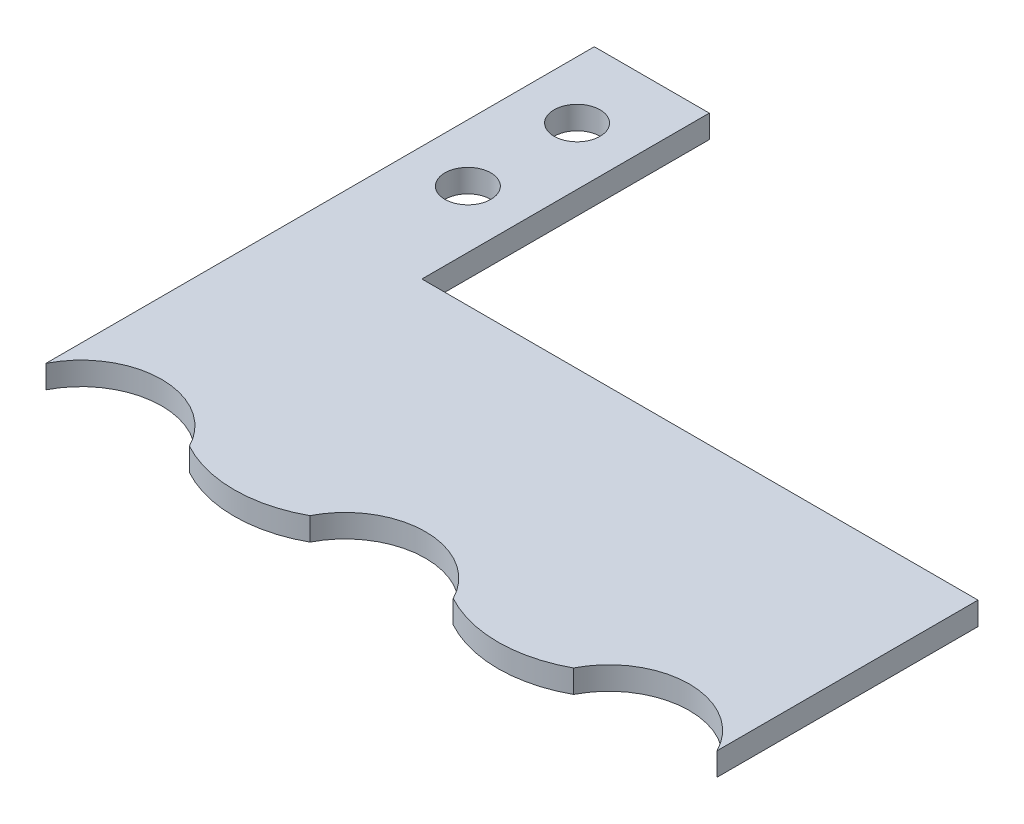
ISO-10303-21;
HEADER;
FILE_DESCRIPTION(('STEP AP214'),'2;1');
FILE_NAME('part.step','',(''),(''),'','','');
FILE_SCHEMA(('AUTOMOTIVE_DESIGN { 1 0 10303 214 1 1 1 1 }'));
ENDSEC;
DATA;
#1=APPLICATION_CONTEXT('core data for automotive mechanical design processes');
#2=APPLICATION_PROTOCOL_DEFINITION('international standard','automotive_design',2000,#1);
#3=PRODUCT_CONTEXT('',#1,'mechanical');
#4=PRODUCT('Part','Part','',(#3));
#5=PRODUCT_RELATED_PRODUCT_CATEGORY('part','',(#4));
#6=PRODUCT_DEFINITION_FORMATION('','',#4);
#7=PRODUCT_DEFINITION_CONTEXT('part definition',#1,'design');
#8=PRODUCT_DEFINITION('design','',#6,#7);
#9=PRODUCT_DEFINITION_SHAPE('','',#8);
#10=(LENGTH_UNIT() NAMED_UNIT(*) SI_UNIT(.MILLI.,.METRE.));
#11=(NAMED_UNIT(*) PLANE_ANGLE_UNIT() SI_UNIT($,.RADIAN.));
#12=(NAMED_UNIT(*) SI_UNIT($,.STERADIAN.) SOLID_ANGLE_UNIT());
#13=UNCERTAINTY_MEASURE_WITH_UNIT(LENGTH_MEASURE(1.E-05),#10,'distance_accuracy_value','');
#14=(GEOMETRIC_REPRESENTATION_CONTEXT(3) GLOBAL_UNCERTAINTY_ASSIGNED_CONTEXT((#13)) GLOBAL_UNIT_ASSIGNED_CONTEXT((#10,
#11,#12)) REPRESENTATION_CONTEXT('',''));
#15=CARTESIAN_POINT('',(0.,0.,0.));
#16=DIRECTION('',(0.,0.,1.));
#17=DIRECTION('',(1.,0.,0.));
#18=AXIS2_PLACEMENT_3D('',#15,#16,#17);
#19=CARTESIAN_POINT('',(-22.95,-2.,0.));
#20=DIRECTION('',(0.,1.,0.));
#21=DIRECTION('',(0.,0.,1.));
#22=AXIS2_PLACEMENT_3D('',#19,#20,#21);
#23=CYLINDRICAL_SURFACE('',#22,7.);
#24=CARTESIAN_POINT('',(-22.95,0.,0.));
#25=DIRECTION('',(0.,-1.,0.));
#26=DIRECTION('',(0.,0.,-1.));
#27=AXIS2_PLACEMENT_3D('',#24,#25,#26);
#28=CIRCLE('',#27,7.);
#29=CARTESIAN_POINT('',(-29.1876437453176,0.,-3.17675943478572));
#30=VERTEX_POINT('',#29);
#31=CARTESIAN_POINT('',(-16.7123562546824,0.,-3.17675943478572));
#32=VERTEX_POINT('',#31);
#33=EDGE_CURVE('E152',#30,#32,#28,.T.);
#34=ORIENTED_EDGE('',*,*,#33,.F.);
#35=DIRECTION('',(0.,1.,0.));
#36=VECTOR('',#35,1.);
#37=CARTESIAN_POINT('',(-29.1876437453176,-2.,-3.17675943478572));
#38=LINE('',#37,#36);
#39=CARTESIAN_POINT('',(-29.1876437453176,-2.,-3.17675943478572));
#40=VERTEX_POINT('',#39);
#41=EDGE_CURVE('E11',#40,#30,#38,.T.);
#42=ORIENTED_EDGE('',*,*,#41,.F.);
#43=CARTESIAN_POINT('',(-22.95,-2.,0.));
#44=DIRECTION('',(0.,-1.,0.));
#45=DIRECTION('',(0.,0.,-1.));
#46=AXIS2_PLACEMENT_3D('',#43,#44,#45);
#47=CIRCLE('',#46,7.);
#48=CARTESIAN_POINT('',(-16.7123562546824,-2.,-3.17675943478572));
#49=VERTEX_POINT('',#48);
#50=EDGE_CURVE('E177',#40,#49,#47,.T.);
#51=ORIENTED_EDGE('',*,*,#50,.T.);
#52=DIRECTION('',(0.,1.,0.));
#53=VECTOR('',#52,1.);
#54=CARTESIAN_POINT('',(-16.7123562546824,-2.,-3.17675943478572));
#55=LINE('',#54,#53);
#56=EDGE_CURVE('E46',#49,#32,#55,.T.);
#57=ORIENTED_EDGE('',*,*,#56,.T.);
#58=EDGE_LOOP('',(#34,#42,#51,#57));
#59=FACE_BOUND('',#58,.T.);
#60=ADVANCED_FACE('F43',(#59),#23,.F.);
#61=CARTESIAN_POINT('',(-29.1876437453176,-2.,-3.17675943478572));
#62=DIRECTION('',(-1.,0.,0.));
#63=DIRECTION('',(0.,0.,1.));
#64=AXIS2_PLACEMENT_3D('',#61,#62,#63);
#65=PLANE('',#64);
#66=DIRECTION('',(0.,0.,1.));
#67=VECTOR('',#66,1.);
#68=CARTESIAN_POINT('',(-29.1876437453176,0.,-3.17675943478572));
#69=LINE('',#68,#67);
#70=CARTESIAN_POINT('',(-29.1876437453176,0.,-50.875));
#71=VERTEX_POINT('',#70);
#72=EDGE_CURVE('E92',#71,#30,#69,.T.);
#73=ORIENTED_EDGE('',*,*,#72,.F.);
#74=DIRECTION('',(0.,1.,0.));
#75=VECTOR('',#74,1.);
#76=CARTESIAN_POINT('',(-29.1876437453176,-2.,-50.875));
#77=LINE('',#76,#75);
#78=CARTESIAN_POINT('',(-29.1876437453176,-2.,-50.875));
#79=VERTEX_POINT('',#78);
#80=EDGE_CURVE('E52',#79,#71,#77,.T.);
#81=ORIENTED_EDGE('',*,*,#80,.F.);
#82=DIRECTION('',(0.,0.,1.));
#83=VECTOR('',#82,1.);
#84=CARTESIAN_POINT('',(-29.1876437453176,-2.,-25.875));
#85=LINE('',#84,#83);
#86=EDGE_CURVE('E60',#79,#40,#85,.T.);
#87=ORIENTED_EDGE('',*,*,#86,.T.);
#88=ORIENTED_EDGE('',*,*,#41,.T.);
#89=EDGE_LOOP('',(#73,#81,#87,#88));
#90=FACE_BOUND('',#89,.T.);
#91=ADVANCED_FACE('F251',(#90),#65,.T.);
#92=CARTESIAN_POINT('',(-29.1876437453176,-2.,-50.875));
#93=DIRECTION('',(0.,0.,-1.));
#94=DIRECTION('',(-1.,0.,0.));
#95=AXIS2_PLACEMENT_3D('',#92,#93,#94);
#96=PLANE('',#95);
#97=DIRECTION('',(-1.,0.,0.));
#98=VECTOR('',#97,1.);
#99=CARTESIAN_POINT('',(-29.1876437453176,0.,-50.875));
#100=LINE('',#99,#98);
#101=CARTESIAN_POINT('',(-19.1876437453176,0.,-50.875));
#102=VERTEX_POINT('',#101);
#103=EDGE_CURVE('E129',#102,#71,#100,.T.);
#104=ORIENTED_EDGE('',*,*,#103,.F.);
#105=DIRECTION('',(0.,1.,0.));
#106=VECTOR('',#105,1.);
#107=CARTESIAN_POINT('',(-19.1876437453176,-2.,-50.875));
#108=LINE('',#107,#106);
#109=CARTESIAN_POINT('',(-19.1876437453176,-2.,-50.875));
#110=VERTEX_POINT('',#109);
#111=EDGE_CURVE('E124',#110,#102,#108,.T.);
#112=ORIENTED_EDGE('',*,*,#111,.F.);
#113=DIRECTION('',(-1.,0.,0.));
#114=VECTOR('',#113,1.);
#115=CARTESIAN_POINT('',(-29.1876437453176,-2.,-50.875));
#116=LINE('',#115,#114);
#117=EDGE_CURVE('E127',#110,#79,#116,.T.);
#118=ORIENTED_EDGE('',*,*,#117,.T.);
#119=ORIENTED_EDGE('',*,*,#80,.T.);
#120=EDGE_LOOP('',(#104,#112,#118,#119));
#121=FACE_BOUND('',#120,.T.);
#122=ADVANCED_FACE('F126',(#121),#96,.T.);
#123=CARTESIAN_POINT('',(-19.1876437453176,-2.,-50.875));
#124=DIRECTION('',(1.,0.,0.));
#125=DIRECTION('',(0.,0.,-1.));
#126=AXIS2_PLACEMENT_3D('',#123,#124,#125);
#127=PLANE('',#126);
#128=DIRECTION('',(0.,0.,-1.));
#129=VECTOR('',#128,1.);
#130=CARTESIAN_POINT('',(-19.1876437453176,0.,-50.875));
#131=LINE('',#130,#129);
#132=CARTESIAN_POINT('',(-19.1876437453176,0.,-25.875));
#133=VERTEX_POINT('',#132);
#134=EDGE_CURVE('E174',#133,#102,#131,.T.);
#135=ORIENTED_EDGE('',*,*,#134,.F.);
#136=DIRECTION('',(0.,1.,0.));
#137=VECTOR('',#136,1.);
#138=CARTESIAN_POINT('',(-19.1876437453176,-2.,-25.875));
#139=LINE('',#138,#137);
#140=CARTESIAN_POINT('',(-19.1876437453176,-2.,-25.875));
#141=VERTEX_POINT('',#140);
#142=EDGE_CURVE('E134',#141,#133,#139,.T.);
#143=ORIENTED_EDGE('',*,*,#142,.F.);
#144=DIRECTION('',(0.,0.,-1.));
#145=VECTOR('',#144,1.);
#146=CARTESIAN_POINT('',(-19.1876437453176,-2.,-50.875));
#147=LINE('',#146,#145);
#148=EDGE_CURVE('E141',#141,#110,#147,.T.);
#149=ORIENTED_EDGE('',*,*,#148,.T.);
#150=ORIENTED_EDGE('',*,*,#111,.T.);
#151=EDGE_LOOP('',(#135,#143,#149,#150));
#152=FACE_BOUND('',#151,.T.);
#153=ADVANCED_FACE('F144',(#152),#127,.T.);
#154=CARTESIAN_POINT('',(-19.1876437453176,-2.,-25.875));
#155=DIRECTION('',(0.,0.,-1.));
#156=DIRECTION('',(-1.,0.,0.));
#157=AXIS2_PLACEMENT_3D('',#154,#155,#156);
#158=PLANE('',#157);
#159=DIRECTION('',(-1.,0.,0.));
#160=VECTOR('',#159,1.);
#161=CARTESIAN_POINT('',(-19.1876437453176,0.,-25.875));
#162=LINE('',#161,#160);
#163=CARTESIAN_POINT('',(29.1876437453176,0.,-25.875));
#164=VERTEX_POINT('',#163);
#165=EDGE_CURVE('E171',#164,#133,#162,.T.);
#166=ORIENTED_EDGE('',*,*,#165,.F.);
#167=DIRECTION('',(0.,1.,0.));
#168=VECTOR('',#167,1.);
#169=CARTESIAN_POINT('',(29.1876437453176,-2.,-25.875));
#170=LINE('',#169,#168);
#171=CARTESIAN_POINT('',(29.1876437453176,-2.,-25.875));
#172=VERTEX_POINT('',#171);
#173=EDGE_CURVE('E181',#172,#164,#170,.T.);
#174=ORIENTED_EDGE('',*,*,#173,.F.);
#175=DIRECTION('',(-1.,0.,0.));
#176=VECTOR('',#175,1.);
#177=CARTESIAN_POINT('',(-19.1876437453176,-2.,-25.875));
#178=LINE('',#177,#176);
#179=EDGE_CURVE('E145',#172,#141,#178,.T.);
#180=ORIENTED_EDGE('',*,*,#179,.T.);
#181=ORIENTED_EDGE('',*,*,#142,.T.);
#182=EDGE_LOOP('',(#166,#174,#180,#181));
#183=FACE_BOUND('',#182,.T.);
#184=ADVANCED_FACE('F198',(#183),#158,.T.);
#185=CARTESIAN_POINT('',(29.1876437453176,-2.,-3.17675943478575));
#186=DIRECTION('',(1.,0.,0.));
#187=DIRECTION('',(0.,0.,-1.));
#188=AXIS2_PLACEMENT_3D('',#185,#186,#187);
#189=PLANE('',#188);
#190=DIRECTION('',(0.,0.,-1.));
#191=VECTOR('',#190,1.);
#192=CARTESIAN_POINT('',(29.1876437453176,0.,-3.17675943478575));
#193=LINE('',#192,#191);
#194=CARTESIAN_POINT('',(29.1876437453176,0.,-3.17675943478575));
#195=VERTEX_POINT('',#194);
#196=EDGE_CURVE('E168',#195,#164,#193,.T.);
#197=ORIENTED_EDGE('',*,*,#196,.F.);
#198=DIRECTION('',(0.,1.,0.));
#199=VECTOR('',#198,1.);
#200=CARTESIAN_POINT('',(29.1876437453176,-2.,-3.17675943478575));
#201=LINE('',#200,#199);
#202=CARTESIAN_POINT('',(29.1876437453176,-2.,-3.17675943478575));
#203=VERTEX_POINT('',#202);
#204=EDGE_CURVE('E183',#203,#195,#201,.T.);
#205=ORIENTED_EDGE('',*,*,#204,.F.);
#206=DIRECTION('',(0.,0.,-1.));
#207=VECTOR('',#206,1.);
#208=CARTESIAN_POINT('',(29.1876437453176,-2.,-3.17675943478575));
#209=LINE('',#208,#207);
#210=EDGE_CURVE('E147',#203,#172,#209,.T.);
#211=ORIENTED_EDGE('',*,*,#210,.T.);
#212=ORIENTED_EDGE('',*,*,#173,.T.);
#213=EDGE_LOOP('',(#197,#205,#211,#212));
#214=FACE_BOUND('',#213,.T.);
#215=ADVANCED_FACE('F204',(#214),#189,.T.);
#216=CARTESIAN_POINT('',(22.95,-2.,0.));
#217=DIRECTION('',(0.,1.,0.));
#218=DIRECTION('',(0.,0.,1.));
#219=AXIS2_PLACEMENT_3D('',#216,#217,#218);
#220=CYLINDRICAL_SURFACE('',#219,7.);
#221=CARTESIAN_POINT('',(22.95,0.,0.));
#222=DIRECTION('',(0.,-1.,0.));
#223=DIRECTION('',(0.,0.,-1.));
#224=AXIS2_PLACEMENT_3D('',#221,#222,#223);
#225=CIRCLE('',#224,7.);
#226=CARTESIAN_POINT('',(16.7123562546824,0.,-3.17675943478572));
#227=VERTEX_POINT('',#226);
#228=EDGE_CURVE('E165',#227,#195,#225,.T.);
#229=ORIENTED_EDGE('',*,*,#228,.F.);
#230=DIRECTION('',(0.,1.,0.));
#231=VECTOR('',#230,1.);
#232=CARTESIAN_POINT('',(16.7123562546824,-2.,-3.17675943478572));
#233=LINE('',#232,#231);
#234=CARTESIAN_POINT('',(16.7123562546824,-2.,-3.17675943478572));
#235=VERTEX_POINT('',#234);
#236=EDGE_CURVE('E185',#235,#227,#233,.T.);
#237=ORIENTED_EDGE('',*,*,#236,.F.);
#238=CARTESIAN_POINT('',(22.95,-2.,0.));
#239=DIRECTION('',(0.,-1.,0.));
#240=DIRECTION('',(0.,0.,-1.));
#241=AXIS2_PLACEMENT_3D('',#238,#239,#240);
#242=CIRCLE('',#241,7.);
#243=EDGE_CURVE('E205',#235,#203,#242,.T.);
#244=ORIENTED_EDGE('',*,*,#243,.T.);
#245=ORIENTED_EDGE('',*,*,#204,.T.);
#246=EDGE_LOOP('',(#229,#237,#244,#245));
#247=FACE_BOUND('',#246,.T.);
#248=ADVANCED_FACE('F267',(#247),#220,.F.);
#249=CARTESIAN_POINT('',(11.475,-2.,-12.7075371817243));
#250=DIRECTION('',(0.,1.,0.));
#251=DIRECTION('',(0.,0.,1.));
#252=AXIS2_PLACEMENT_3D('',#249,#250,#251);
#253=CYLINDRICAL_SURFACE('',#252,10.875);
#254=CARTESIAN_POINT('',(11.475,0.,-12.7075371817243));
#255=DIRECTION('',(0.,1.,0.));
#256=DIRECTION('',(0.,0.,1.));
#257=AXIS2_PLACEMENT_3D('',#254,#255,#256);
#258=CIRCLE('',#257,10.875);
#259=CARTESIAN_POINT('',(6.23764374531761,0.,-3.17675943478572));
#260=VERTEX_POINT('',#259);
#261=EDGE_CURVE('E162',#260,#227,#258,.T.);
#262=ORIENTED_EDGE('',*,*,#261,.F.);
#263=DIRECTION('',(0.,1.,0.));
#264=VECTOR('',#263,1.);
#265=CARTESIAN_POINT('',(6.23764374531761,-2.,-3.17675943478572));
#266=LINE('',#265,#264);
#267=CARTESIAN_POINT('',(6.23764374531761,-2.,-3.17675943478572));
#268=VERTEX_POINT('',#267);
#269=EDGE_CURVE('E187',#268,#260,#266,.T.);
#270=ORIENTED_EDGE('',*,*,#269,.F.);
#271=CARTESIAN_POINT('',(11.475,-2.,-12.7075371817243));
#272=DIRECTION('',(0.,1.,0.));
#273=DIRECTION('',(0.,0.,1.));
#274=AXIS2_PLACEMENT_3D('',#271,#272,#273);
#275=CIRCLE('',#274,10.875);
#276=EDGE_CURVE('E206',#268,#235,#275,.T.);
#277=ORIENTED_EDGE('',*,*,#276,.T.);
#278=ORIENTED_EDGE('',*,*,#236,.T.);
#279=EDGE_LOOP('',(#262,#270,#277,#278));
#280=FACE_BOUND('',#279,.T.);
#281=ADVANCED_FACE('F270',(#280),#253,.T.);
#282=CARTESIAN_POINT('',(0.,-2.,0.));
#283=DIRECTION('',(0.,1.,0.));
#284=DIRECTION('',(0.,0.,1.));
#285=AXIS2_PLACEMENT_3D('',#282,#283,#284);
#286=CYLINDRICAL_SURFACE('',#285,7.);
#287=CARTESIAN_POINT('',(0.,0.,0.));
#288=DIRECTION('',(0.,-1.,0.));
#289=DIRECTION('',(0.,0.,-1.));
#290=AXIS2_PLACEMENT_3D('',#287,#288,#289);
#291=CIRCLE('',#290,7.);
#292=CARTESIAN_POINT('',(-6.23764374531761,0.,-3.17675943478572));
#293=VERTEX_POINT('',#292);
#294=EDGE_CURVE('E159',#293,#260,#291,.T.);
#295=ORIENTED_EDGE('',*,*,#294,.F.);
#296=DIRECTION('',(0.,1.,0.));
#297=VECTOR('',#296,1.);
#298=CARTESIAN_POINT('',(-6.23764374531761,-2.,-3.17675943478572));
#299=LINE('',#298,#297);
#300=CARTESIAN_POINT('',(-6.23764374531761,-2.,-3.17675943478572));
#301=VERTEX_POINT('',#300);
#302=EDGE_CURVE('E188',#301,#293,#299,.T.);
#303=ORIENTED_EDGE('',*,*,#302,.F.);
#304=CARTESIAN_POINT('',(0.,-2.,0.));
#305=DIRECTION('',(0.,-1.,0.));
#306=DIRECTION('',(0.,0.,-1.));
#307=AXIS2_PLACEMENT_3D('',#304,#305,#306);
#308=CIRCLE('',#307,7.);
#309=EDGE_CURVE('E211',#301,#268,#308,.T.);
#310=ORIENTED_EDGE('',*,*,#309,.T.);
#311=ORIENTED_EDGE('',*,*,#269,.T.);
#312=EDGE_LOOP('',(#295,#303,#310,#311));
#313=FACE_BOUND('',#312,.T.);
#314=ADVANCED_FACE('F249',(#313),#286,.F.);
#315=CARTESIAN_POINT('',(-11.475,-2.,-12.7075371817243));
#316=DIRECTION('',(0.,1.,0.));
#317=DIRECTION('',(0.,0.,1.));
#318=AXIS2_PLACEMENT_3D('',#315,#316,#317);
#319=CYLINDRICAL_SURFACE('',#318,10.875);
#320=CARTESIAN_POINT('',(-11.475,0.,-12.7075371817243));
#321=DIRECTION('',(0.,1.,0.));
#322=DIRECTION('',(0.,0.,1.));
#323=AXIS2_PLACEMENT_3D('',#320,#321,#322);
#324=CIRCLE('',#323,10.875);
#325=EDGE_CURVE('E155',#32,#293,#324,.T.);
#326=ORIENTED_EDGE('',*,*,#325,.F.);
#327=ORIENTED_EDGE('',*,*,#56,.F.);
#328=CARTESIAN_POINT('',(-11.475,-2.,-12.7075371817243));
#329=DIRECTION('',(0.,1.,0.));
#330=DIRECTION('',(0.,0.,1.));
#331=AXIS2_PLACEMENT_3D('',#328,#329,#330);
#332=CIRCLE('',#331,10.875);
#333=EDGE_CURVE('E214',#49,#301,#332,.T.);
#334=ORIENTED_EDGE('',*,*,#333,.T.);
#335=ORIENTED_EDGE('',*,*,#302,.T.);
#336=EDGE_LOOP('',(#326,#327,#334,#335));
#337=FACE_BOUND('',#336,.T.);
#338=ADVANCED_FACE('F192',(#337),#319,.T.);
#339=CARTESIAN_POINT('',(-22.95,-2.,0.));
#340=DIRECTION('',(0.,-1.,0.));
#341=DIRECTION('',(0.,0.,-1.));
#342=AXIS2_PLACEMENT_3D('',#339,#340,#341);
#343=PLANE('',#342);
#344=CARTESIAN_POINT('',(-24.1876437453176,-2.,-44.375));
#345=DIRECTION('',(0.,-1.,0.));
#346=DIRECTION('',(0.,0.,-1.));
#347=AXIS2_PLACEMENT_3D('',#344,#345,#346);
#348=CIRCLE('',#347,2.);
#349=CARTESIAN_POINT('',(-24.1876437453176,-2.,-42.375));
#350=VERTEX_POINT('',#349);
#351=EDGE_CURVE('E156',#350,#350,#348,.F.);
#352=ORIENTED_EDGE('',*,*,#351,.T.);
#353=EDGE_LOOP('',(#352));
#354=FACE_BOUND('',#353,.T.);
#355=CARTESIAN_POINT('',(-24.1876437453176,-2.,-34.875));
#356=DIRECTION('',(0.,-1.,0.));
#357=DIRECTION('',(0.,0.,-1.));
#358=AXIS2_PLACEMENT_3D('',#355,#356,#357);
#359=CIRCLE('',#358,2.);
#360=CARTESIAN_POINT('',(-24.1876437453176,-2.,-32.875));
#361=VERTEX_POINT('',#360);
#362=EDGE_CURVE('E221',#361,#361,#359,.F.);
#363=ORIENTED_EDGE('',*,*,#362,.T.);
#364=EDGE_LOOP('',(#363));
#365=FACE_BOUND('',#364,.T.);
#366=ORIENTED_EDGE('',*,*,#50,.F.);
#367=ORIENTED_EDGE('',*,*,#86,.F.);
#368=ORIENTED_EDGE('',*,*,#117,.F.);
#369=ORIENTED_EDGE('',*,*,#148,.F.);
#370=ORIENTED_EDGE('',*,*,#179,.F.);
#371=ORIENTED_EDGE('',*,*,#210,.F.);
#372=ORIENTED_EDGE('',*,*,#243,.F.);
#373=ORIENTED_EDGE('',*,*,#276,.F.);
#374=ORIENTED_EDGE('',*,*,#309,.F.);
#375=ORIENTED_EDGE('',*,*,#333,.F.);
#376=EDGE_LOOP('',(#366,#367,#368,#369,#370,#371,#372,#373,#374,#375));
#377=FACE_BOUND('',#376,.T.);
#378=ADVANCED_FACE('F139',(#354,#365,#377),#343,.T.);
#379=CARTESIAN_POINT('',(-22.95,0.,0.));
#380=DIRECTION('',(0.,-1.,0.));
#381=DIRECTION('',(0.,0.,-1.));
#382=AXIS2_PLACEMENT_3D('',#379,#380,#381);
#383=PLANE('',#382);
#384=CARTESIAN_POINT('',(-24.1876437453176,0.,-44.375));
#385=DIRECTION('',(0.,1.,0.));
#386=DIRECTION('',(0.,0.,1.));
#387=AXIS2_PLACEMENT_3D('',#384,#385,#386);
#388=CIRCLE('',#387,2.);
#389=CARTESIAN_POINT('',(-24.1876437453176,0.,-42.375));
#390=VERTEX_POINT('',#389);
#391=EDGE_CURVE('E220',#390,#390,#388,.T.);
#392=ORIENTED_EDGE('',*,*,#391,.F.);
#393=EDGE_LOOP('',(#392));
#394=FACE_BOUND('',#393,.T.);
#395=CARTESIAN_POINT('',(-24.1876437453176,0.,-34.875));
#396=DIRECTION('',(0.,1.,0.));
#397=DIRECTION('',(0.,0.,1.));
#398=AXIS2_PLACEMENT_3D('',#395,#396,#397);
#399=CIRCLE('',#398,2.);
#400=CARTESIAN_POINT('',(-24.1876437453176,0.,-32.875));
#401=VERTEX_POINT('',#400);
#402=EDGE_CURVE('E217',#401,#401,#399,.T.);
#403=ORIENTED_EDGE('',*,*,#402,.F.);
#404=EDGE_LOOP('',(#403));
#405=FACE_BOUND('',#404,.T.);
#406=ORIENTED_EDGE('',*,*,#33,.T.);
#407=ORIENTED_EDGE('',*,*,#325,.T.);
#408=ORIENTED_EDGE('',*,*,#294,.T.);
#409=ORIENTED_EDGE('',*,*,#261,.T.);
#410=ORIENTED_EDGE('',*,*,#228,.T.);
#411=ORIENTED_EDGE('',*,*,#196,.T.);
#412=ORIENTED_EDGE('',*,*,#165,.T.);
#413=ORIENTED_EDGE('',*,*,#134,.T.);
#414=ORIENTED_EDGE('',*,*,#103,.T.);
#415=ORIENTED_EDGE('',*,*,#72,.T.);
#416=EDGE_LOOP('',(#406,#407,#408,#409,#410,#411,#412,#413,#414,#415));
#417=FACE_BOUND('',#416,.T.);
#418=ADVANCED_FACE('F194',(#394,#405,#417),#383,.F.);
#419=CARTESIAN_POINT('',(-24.1876437453176,-7.65685424949238,-34.875));
#420=DIRECTION('',(0.,1.,0.));
#421=DIRECTION('',(0.,0.,1.));
#422=AXIS2_PLACEMENT_3D('',#419,#420,#421);
#423=CYLINDRICAL_SURFACE('',#422,2.);
#424=CARTESIAN_POINT('',(-24.1876437453176,0.,-32.875));
#425=CARTESIAN_POINT('',(-24.1876437453176,-0.0208333333333342,-32.875));
#426=CARTESIAN_POINT('',(-24.1876437453176,-0.0416666666666676,-32.875));
#427=CARTESIAN_POINT('',(-24.1876437453176,-0.0833333333333343,-32.875));
#428=CARTESIAN_POINT('',(-24.1876437453176,-0.104166666666668,-32.875));
#429=CARTESIAN_POINT('',(-24.1876437453176,-0.145833333333334,-32.875));
#430=CARTESIAN_POINT('',(-24.1876437453176,-0.166666666666668,-32.875));
#431=CARTESIAN_POINT('',(-24.1876437453176,-0.208333333333334,-32.875));
#432=CARTESIAN_POINT('',(-24.1876437453176,-0.229166666666668,-32.875));
#433=CARTESIAN_POINT('',(-24.1876437453176,-0.270833333333334,-32.875));
#434=CARTESIAN_POINT('',(-24.1876437453176,-0.291666666666667,-32.875));
#435=CARTESIAN_POINT('',(-24.1876437453176,-0.333333333333334,-32.875));
#436=CARTESIAN_POINT('',(-24.1876437453176,-0.354166666666667,-32.875));
#437=CARTESIAN_POINT('',(-24.1876437453176,-0.395833333333334,-32.875));
#438=CARTESIAN_POINT('',(-24.1876437453176,-0.416666666666667,-32.875));
#439=CARTESIAN_POINT('',(-24.1876437453176,-0.458333333333334,-32.875));
#440=CARTESIAN_POINT('',(-24.1876437453176,-0.479166666666667,-32.875));
#441=CARTESIAN_POINT('',(-24.1876437453176,-0.520833333333334,-32.875));
#442=CARTESIAN_POINT('',(-24.1876437453176,-0.541666666666667,-32.875));
#443=CARTESIAN_POINT('',(-24.1876437453176,-0.583333333333334,-32.875));
#444=CARTESIAN_POINT('',(-24.1876437453176,-0.604166666666667,-32.875));
#445=CARTESIAN_POINT('',(-24.1876437453176,-0.645833333333334,-32.875));
#446=CARTESIAN_POINT('',(-24.1876437453176,-0.666666666666667,-32.875));
#447=CARTESIAN_POINT('',(-24.1876437453176,-0.708333333333334,-32.875));
#448=CARTESIAN_POINT('',(-24.1876437453176,-0.729166666666667,-32.875));
#449=CARTESIAN_POINT('',(-24.1876437453176,-0.770833333333333,-32.875));
#450=CARTESIAN_POINT('',(-24.1876437453176,-0.791666666666667,-32.875));
#451=CARTESIAN_POINT('',(-24.1876437453176,-0.833333333333333,-32.875));
#452=CARTESIAN_POINT('',(-24.1876437453176,-0.854166666666667,-32.875));
#453=CARTESIAN_POINT('',(-24.1876437453176,-0.895833333333333,-32.875));
#454=CARTESIAN_POINT('',(-24.1876437453176,-0.916666666666667,-32.875));
#455=CARTESIAN_POINT('',(-24.1876437453176,-0.958333333333333,-32.875));
#456=CARTESIAN_POINT('',(-24.1876437453176,-0.979166666666667,-32.875));
#457=CARTESIAN_POINT('',(-24.1876437453176,-1.02083333333333,-32.875));
#458=CARTESIAN_POINT('',(-24.1876437453176,-1.04166666666667,-32.875));
#459=CARTESIAN_POINT('',(-24.1876437453176,-1.08333333333333,-32.875));
#460=CARTESIAN_POINT('',(-24.1876437453176,-1.10416666666667,-32.875));
#461=CARTESIAN_POINT('',(-24.1876437453176,-1.14583333333333,-32.875));
#462=CARTESIAN_POINT('',(-24.1876437453176,-1.16666666666667,-32.875));
#463=CARTESIAN_POINT('',(-24.1876437453176,-1.20833333333333,-32.875));
#464=CARTESIAN_POINT('',(-24.1876437453176,-1.22916666666667,-32.875));
#465=CARTESIAN_POINT('',(-24.1876437453176,-1.27083333333333,-32.875));
#466=CARTESIAN_POINT('',(-24.1876437453176,-1.29166666666667,-32.875));
#467=CARTESIAN_POINT('',(-24.1876437453176,-1.33333333333333,-32.875));
#468=CARTESIAN_POINT('',(-24.1876437453176,-1.35416666666667,-32.875));
#469=CARTESIAN_POINT('',(-24.1876437453176,-1.39583333333333,-32.875));
#470=CARTESIAN_POINT('',(-24.1876437453176,-1.41666666666667,-32.875));
#471=CARTESIAN_POINT('',(-24.1876437453176,-1.45833333333333,-32.875));
#472=CARTESIAN_POINT('',(-24.1876437453176,-1.47916666666667,-32.875));
#473=CARTESIAN_POINT('',(-24.1876437453176,-1.52083333333333,-32.875));
#474=CARTESIAN_POINT('',(-24.1876437453176,-1.54166666666667,-32.875));
#475=CARTESIAN_POINT('',(-24.1876437453176,-1.58333333333333,-32.875));
#476=CARTESIAN_POINT('',(-24.1876437453176,-1.60416666666667,-32.875));
#477=CARTESIAN_POINT('',(-24.1876437453176,-1.64583333333333,-32.875));
#478=CARTESIAN_POINT('',(-24.1876437453176,-1.66666666666667,-32.875));
#479=CARTESIAN_POINT('',(-24.1876437453176,-1.70833333333333,-32.875));
#480=CARTESIAN_POINT('',(-24.1876437453176,-1.72916666666667,-32.875));
#481=CARTESIAN_POINT('',(-24.1876437453176,-1.77083333333333,-32.875));
#482=CARTESIAN_POINT('',(-24.1876437453176,-1.79166666666667,-32.875));
#483=CARTESIAN_POINT('',(-24.1876437453176,-1.83333333333333,-32.875));
#484=CARTESIAN_POINT('',(-24.1876437453176,-1.85416666666667,-32.875));
#485=CARTESIAN_POINT('',(-24.1876437453176,-1.89583333333333,-32.875));
#486=CARTESIAN_POINT('',(-24.1876437453176,-1.91666666666667,-32.875));
#487=CARTESIAN_POINT('',(-24.1876437453176,-1.95833333333333,-32.875));
#488=CARTESIAN_POINT('',(-24.1876437453176,-1.97916666666667,-32.875));
#489=CARTESIAN_POINT('',(-24.1876437453176,-2.,-32.875));
#490=B_SPLINE_CURVE_WITH_KNOTS('',3,(#424,#425,#426,#427,#428,#429,#430,#431,#432,#433,#434,
#435,#436,#437,#438,#439,#440,#441,#442,#443,#444,#445,#446,#447,#448,#449,#450,#451,#452,#453,
#454,#455,#456,#457,#458,#459,#460,#461,#462,#463,#464,#465,#466,#467,#468,#469,#470,#471,#472,
#473,#474,#475,#476,#477,#478,#479,#480,#481,#482,#483,#484,#485,#486,#487,#488,#489),
.UNSPECIFIED.,.F.,.F.,(4,2,2,2,2,2,2,2,2,2,2,2,2,2,2,2,2,2,2,2,2,2,2,2,2,2,2,2,2,2,2,2,4),(0.,
0.0625000000000001,0.125,0.1875,0.25,0.312499999999999,0.374999999999999,0.4375,0.5,0.5625,
0.625,0.6875,0.749999999999999,0.812499999999999,0.874999999999999,0.937499999999999,
0.999999999999999,1.0625,1.125,1.1875,1.25,1.3125,1.375,1.4375,1.5,1.5625,1.625,1.6875,1.75,
1.8125,1.875,1.9375,2.),.UNSPECIFIED.);
#491=EDGE_CURVE('BSEAM234',#401,#361,#490,.T.);
#492=ORIENTED_EDGE('',*,*,#402,.T.);
#493=ORIENTED_EDGE('',*,*,#362,.F.);
#494=ORIENTED_EDGE('',*,*,#491,.T.);
#495=ORIENTED_EDGE('',*,*,#491,.F.);
#496=EDGE_LOOP('',(#492,#494,#493,#495));
#497=FACE_BOUND('',#496,.T.);
#498=ADVANCED_FACE('F234',(#497),#423,.F.);
#499=CARTESIAN_POINT('',(-24.1876437453176,-7.65685424949238,-44.375));
#500=DIRECTION('',(0.,1.,0.));
#501=DIRECTION('',(0.,0.,1.));
#502=AXIS2_PLACEMENT_3D('',#499,#500,#501);
#503=CYLINDRICAL_SURFACE('',#502,2.);
#504=CARTESIAN_POINT('',(-24.1876437453176,0.,-42.375));
#505=CARTESIAN_POINT('',(-24.1876437453176,-0.0208333333333342,-42.375));
#506=CARTESIAN_POINT('',(-24.1876437453176,-0.0416666666666676,-42.375));
#507=CARTESIAN_POINT('',(-24.1876437453176,-0.0833333333333343,-42.375));
#508=CARTESIAN_POINT('',(-24.1876437453176,-0.104166666666668,-42.375));
#509=CARTESIAN_POINT('',(-24.1876437453176,-0.145833333333334,-42.375));
#510=CARTESIAN_POINT('',(-24.1876437453176,-0.166666666666668,-42.375));
#511=CARTESIAN_POINT('',(-24.1876437453176,-0.208333333333334,-42.375));
#512=CARTESIAN_POINT('',(-24.1876437453176,-0.229166666666668,-42.375));
#513=CARTESIAN_POINT('',(-24.1876437453176,-0.270833333333334,-42.375));
#514=CARTESIAN_POINT('',(-24.1876437453176,-0.291666666666667,-42.375));
#515=CARTESIAN_POINT('',(-24.1876437453176,-0.333333333333334,-42.375));
#516=CARTESIAN_POINT('',(-24.1876437453176,-0.354166666666667,-42.375));
#517=CARTESIAN_POINT('',(-24.1876437453176,-0.395833333333334,-42.375));
#518=CARTESIAN_POINT('',(-24.1876437453176,-0.416666666666667,-42.375));
#519=CARTESIAN_POINT('',(-24.1876437453176,-0.458333333333334,-42.375));
#520=CARTESIAN_POINT('',(-24.1876437453176,-0.479166666666667,-42.375));
#521=CARTESIAN_POINT('',(-24.1876437453176,-0.520833333333334,-42.375));
#522=CARTESIAN_POINT('',(-24.1876437453176,-0.541666666666667,-42.375));
#523=CARTESIAN_POINT('',(-24.1876437453176,-0.583333333333334,-42.375));
#524=CARTESIAN_POINT('',(-24.1876437453176,-0.604166666666667,-42.375));
#525=CARTESIAN_POINT('',(-24.1876437453176,-0.645833333333334,-42.375));
#526=CARTESIAN_POINT('',(-24.1876437453176,-0.666666666666667,-42.375));
#527=CARTESIAN_POINT('',(-24.1876437453176,-0.708333333333334,-42.375));
#528=CARTESIAN_POINT('',(-24.1876437453176,-0.729166666666667,-42.375));
#529=CARTESIAN_POINT('',(-24.1876437453176,-0.770833333333333,-42.375));
#530=CARTESIAN_POINT('',(-24.1876437453176,-0.791666666666667,-42.375));
#531=CARTESIAN_POINT('',(-24.1876437453176,-0.833333333333333,-42.375));
#532=CARTESIAN_POINT('',(-24.1876437453176,-0.854166666666667,-42.375));
#533=CARTESIAN_POINT('',(-24.1876437453176,-0.895833333333333,-42.375));
#534=CARTESIAN_POINT('',(-24.1876437453176,-0.916666666666667,-42.375));
#535=CARTESIAN_POINT('',(-24.1876437453176,-0.958333333333333,-42.375));
#536=CARTESIAN_POINT('',(-24.1876437453176,-0.979166666666667,-42.375));
#537=CARTESIAN_POINT('',(-24.1876437453176,-1.02083333333333,-42.375));
#538=CARTESIAN_POINT('',(-24.1876437453176,-1.04166666666667,-42.375));
#539=CARTESIAN_POINT('',(-24.1876437453176,-1.08333333333333,-42.375));
#540=CARTESIAN_POINT('',(-24.1876437453176,-1.10416666666667,-42.375));
#541=CARTESIAN_POINT('',(-24.1876437453176,-1.14583333333333,-42.375));
#542=CARTESIAN_POINT('',(-24.1876437453176,-1.16666666666667,-42.375));
#543=CARTESIAN_POINT('',(-24.1876437453176,-1.20833333333333,-42.375));
#544=CARTESIAN_POINT('',(-24.1876437453176,-1.22916666666667,-42.375));
#545=CARTESIAN_POINT('',(-24.1876437453176,-1.27083333333333,-42.375));
#546=CARTESIAN_POINT('',(-24.1876437453176,-1.29166666666667,-42.375));
#547=CARTESIAN_POINT('',(-24.1876437453176,-1.33333333333333,-42.375));
#548=CARTESIAN_POINT('',(-24.1876437453176,-1.35416666666667,-42.375));
#549=CARTESIAN_POINT('',(-24.1876437453176,-1.39583333333333,-42.375));
#550=CARTESIAN_POINT('',(-24.1876437453176,-1.41666666666667,-42.375));
#551=CARTESIAN_POINT('',(-24.1876437453176,-1.45833333333333,-42.375));
#552=CARTESIAN_POINT('',(-24.1876437453176,-1.47916666666667,-42.375));
#553=CARTESIAN_POINT('',(-24.1876437453176,-1.52083333333333,-42.375));
#554=CARTESIAN_POINT('',(-24.1876437453176,-1.54166666666667,-42.375));
#555=CARTESIAN_POINT('',(-24.1876437453176,-1.58333333333333,-42.375));
#556=CARTESIAN_POINT('',(-24.1876437453176,-1.60416666666667,-42.375));
#557=CARTESIAN_POINT('',(-24.1876437453176,-1.64583333333333,-42.375));
#558=CARTESIAN_POINT('',(-24.1876437453176,-1.66666666666667,-42.375));
#559=CARTESIAN_POINT('',(-24.1876437453176,-1.70833333333333,-42.375));
#560=CARTESIAN_POINT('',(-24.1876437453176,-1.72916666666667,-42.375));
#561=CARTESIAN_POINT('',(-24.1876437453176,-1.77083333333333,-42.375));
#562=CARTESIAN_POINT('',(-24.1876437453176,-1.79166666666667,-42.375));
#563=CARTESIAN_POINT('',(-24.1876437453176,-1.83333333333333,-42.375));
#564=CARTESIAN_POINT('',(-24.1876437453176,-1.85416666666667,-42.375));
#565=CARTESIAN_POINT('',(-24.1876437453176,-1.89583333333333,-42.375));
#566=CARTESIAN_POINT('',(-24.1876437453176,-1.91666666666667,-42.375));
#567=CARTESIAN_POINT('',(-24.1876437453176,-1.95833333333333,-42.375));
#568=CARTESIAN_POINT('',(-24.1876437453176,-1.97916666666667,-42.375));
#569=CARTESIAN_POINT('',(-24.1876437453176,-2.,-42.375));
#570=B_SPLINE_CURVE_WITH_KNOTS('',3,(#504,#505,#506,#507,#508,#509,#510,#511,#512,#513,#514,
#515,#516,#517,#518,#519,#520,#521,#522,#523,#524,#525,#526,#527,#528,#529,#530,#531,#532,#533,
#534,#535,#536,#537,#538,#539,#540,#541,#542,#543,#544,#545,#546,#547,#548,#549,#550,#551,#552,
#553,#554,#555,#556,#557,#558,#559,#560,#561,#562,#563,#564,#565,#566,#567,#568,#569),
.UNSPECIFIED.,.F.,.F.,(4,2,2,2,2,2,2,2,2,2,2,2,2,2,2,2,2,2,2,2,2,2,2,2,2,2,2,2,2,2,2,2,4),(0.,
0.0625000000000001,0.125,0.1875,0.25,0.312499999999999,0.374999999999999,0.4375,0.5,0.5625,
0.625,0.6875,0.749999999999999,0.812499999999999,0.874999999999999,0.937499999999999,
0.999999999999999,1.0625,1.125,1.1875,1.25,1.3125,1.375,1.4375,1.5,1.5625,1.625,1.6875,1.75,
1.8125,1.875,1.9375,2.),.UNSPECIFIED.);
#571=EDGE_CURVE('BSEAM229',#390,#350,#570,.T.);
#572=ORIENTED_EDGE('',*,*,#391,.T.);
#573=ORIENTED_EDGE('',*,*,#351,.F.);
#574=ORIENTED_EDGE('',*,*,#571,.T.);
#575=ORIENTED_EDGE('',*,*,#571,.F.);
#576=EDGE_LOOP('',(#572,#574,#573,#575));
#577=FACE_BOUND('',#576,.T.);
#578=ADVANCED_FACE('F229',(#577),#503,.F.);
#579=CLOSED_SHELL('',(#60,#91,#122,#153,#184,#215,#248,#281,#314,#338,#378,#418,#498,#578));
#580=MANIFOLD_SOLID_BREP('B2',#579);
#581=ADVANCED_BREP_SHAPE_REPRESENTATION('',(#18,#580),#14);
#582=SHAPE_DEFINITION_REPRESENTATION(#9,#581);
ENDSEC;
END-ISO-10303-21;
